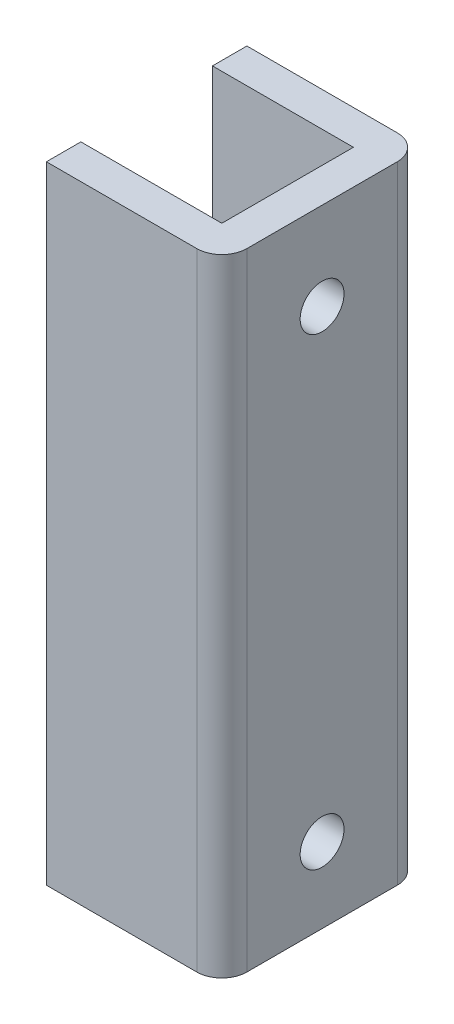
ISO-10303-21;
HEADER;
FILE_DESCRIPTION(('STEP AP214'),'2;1');
FILE_NAME('part.step','',(''),(''),'','','');
FILE_SCHEMA(('AUTOMOTIVE_DESIGN { 1 0 10303 214 1 1 1 1 }'));
ENDSEC;
DATA;
#1=APPLICATION_CONTEXT('core data for automotive mechanical design processes');
#2=APPLICATION_PROTOCOL_DEFINITION('international standard','automotive_design',2000,#1);
#3=PRODUCT_CONTEXT('',#1,'mechanical');
#4=PRODUCT('Part','Part','',(#3));
#5=PRODUCT_RELATED_PRODUCT_CATEGORY('part','',(#4));
#6=PRODUCT_DEFINITION_FORMATION('','',#4);
#7=PRODUCT_DEFINITION_CONTEXT('part definition',#1,'design');
#8=PRODUCT_DEFINITION('design','',#6,#7);
#9=PRODUCT_DEFINITION_SHAPE('','',#8);
#10=(LENGTH_UNIT() NAMED_UNIT(*) SI_UNIT(.MILLI.,.METRE.));
#11=(NAMED_UNIT(*) PLANE_ANGLE_UNIT() SI_UNIT($,.RADIAN.));
#12=(NAMED_UNIT(*) SI_UNIT($,.STERADIAN.) SOLID_ANGLE_UNIT());
#13=UNCERTAINTY_MEASURE_WITH_UNIT(LENGTH_MEASURE(1.E-05),#10,'distance_accuracy_value','');
#14=(GEOMETRIC_REPRESENTATION_CONTEXT(3) GLOBAL_UNCERTAINTY_ASSIGNED_CONTEXT((#13)) GLOBAL_UNIT_ASSIGNED_CONTEXT((#10,
#11,#12)) REPRESENTATION_CONTEXT('',''));
#15=CARTESIAN_POINT('',(0.,0.,0.));
#16=DIRECTION('',(0.,0.,1.));
#17=DIRECTION('',(1.,0.,0.));
#18=AXIS2_PLACEMENT_3D('',#15,#16,#17);
#19=CARTESIAN_POINT('',(-8.95384615384615,50.,-10.5076923076923));
#20=DIRECTION('',(1.,0.,0.));
#21=DIRECTION('',(0.,0.,-1.));
#22=AXIS2_PLACEMENT_3D('',#19,#20,#21);
#23=PLANE('',#22);
#24=DIRECTION('',(0.,0.,1.));
#25=VECTOR('',#24,1.);
#26=CARTESIAN_POINT('',(-8.95384615384615,50.,-10.5076923076923));
#27=LINE('',#26,#25);
#28=CARTESIAN_POINT('',(-8.95384615384615,50.,2.74230769230769));
#29=VERTEX_POINT('',#28);
#30=CARTESIAN_POINT('',(-8.95384615384615,50.,5.49230769230769));
#31=VERTEX_POINT('',#30);
#32=EDGE_CURVE('E228',#29,#31,#27,.T.);
#33=ORIENTED_EDGE('',*,*,#32,.F.);
#34=DIRECTION('',(0.,1.,0.));
#35=VECTOR('',#34,1.);
#36=CARTESIAN_POINT('',(-8.95384615384615,0.,2.74230769230769));
#37=LINE('',#36,#35);
#38=CARTESIAN_POINT('',(-8.95384615384615,0.,2.74230769230769));
#39=VERTEX_POINT('',#38);
#40=EDGE_CURVE('E193',#39,#29,#37,.T.);
#41=ORIENTED_EDGE('',*,*,#40,.F.);
#42=DIRECTION('',(0.,0.,1.));
#43=VECTOR('',#42,1.);
#44=CARTESIAN_POINT('',(-8.95384615384615,0.,-10.5076923076923));
#45=LINE('',#44,#43);
#46=CARTESIAN_POINT('',(-8.95384615384615,0.,5.49230769230769));
#47=VERTEX_POINT('',#46);
#48=EDGE_CURVE('E149',#39,#47,#45,.T.);
#49=ORIENTED_EDGE('',*,*,#48,.T.);
#50=DIRECTION('',(0.,-1.,0.));
#51=VECTOR('',#50,1.);
#52=CARTESIAN_POINT('',(-8.95384615384615,50.,5.49230769230769));
#53=LINE('',#52,#51);
#54=EDGE_CURVE('E49',#31,#47,#53,.T.);
#55=ORIENTED_EDGE('',*,*,#54,.F.);
#56=EDGE_LOOP('',(#33,#41,#49,#55));
#57=FACE_BOUND('',#56,.T.);
#58=ADVANCED_FACE('F39',(#57),#23,.F.);
#59=CARTESIAN_POINT('',(-8.95384615384615,50.,-10.5076923076923));
#60=DIRECTION('',(0.,0.,1.));
#61=DIRECTION('',(1.,0.,0.));
#62=AXIS2_PLACEMENT_3D('',#59,#60,#61);
#63=PLANE('',#62);
#64=DIRECTION('',(-1.,0.,0.));
#65=VECTOR('',#64,1.);
#66=CARTESIAN_POINT('',(-8.95384615384615,0.,-10.5076923076923));
#67=LINE('',#66,#65);
#68=CARTESIAN_POINT('',(3.04615384615385,0.,-10.5076923076923));
#69=VERTEX_POINT('',#68);
#70=CARTESIAN_POINT('',(-8.95384615384615,0.,-10.5076923076923));
#71=VERTEX_POINT('',#70);
#72=EDGE_CURVE('E145',#69,#71,#67,.T.);
#73=ORIENTED_EDGE('',*,*,#72,.T.);
#74=DIRECTION('',(0.,-1.,0.));
#75=VECTOR('',#74,1.);
#76=CARTESIAN_POINT('',(-8.95384615384615,50.,-10.5076923076923));
#77=LINE('',#76,#75);
#78=CARTESIAN_POINT('',(-8.95384615384615,50.,-10.5076923076923));
#79=VERTEX_POINT('',#78);
#80=EDGE_CURVE('E11',#79,#71,#77,.T.);
#81=ORIENTED_EDGE('',*,*,#80,.F.);
#82=DIRECTION('',(-1.,0.,0.));
#83=VECTOR('',#82,1.);
#84=CARTESIAN_POINT('',(-8.95384615384615,50.,-10.5076923076923));
#85=LINE('',#84,#83);
#86=CARTESIAN_POINT('',(3.04615384615385,50.,-10.5076923076923));
#87=VERTEX_POINT('',#86);
#88=EDGE_CURVE('E165',#87,#79,#85,.T.);
#89=ORIENTED_EDGE('',*,*,#88,.F.);
#90=DIRECTION('',(0.,-1.,0.));
#91=VECTOR('',#90,1.);
#92=CARTESIAN_POINT('',(3.04615384615385,50.,-10.5076923076923));
#93=LINE('',#92,#91);
#94=EDGE_CURVE('E141',#87,#69,#93,.T.);
#95=ORIENTED_EDGE('',*,*,#94,.T.);
#96=EDGE_LOOP('',(#73,#81,#89,#95));
#97=FACE_BOUND('',#96,.T.);
#98=ADVANCED_FACE('F41',(#97),#63,.F.);
#99=CARTESIAN_POINT('',(-8.95384615384615,0.,-7.75769230769231));
#100=VERTEX_POINT('',#99);
#101=EDGE_CURVE('E151',#71,#100,#45,.T.);
#102=ORIENTED_EDGE('',*,*,#101,.T.);
#103=DIRECTION('',(0.,1.,0.));
#104=VECTOR('',#103,1.);
#105=CARTESIAN_POINT('',(-8.95384615384615,0.,-7.75769230769231));
#106=LINE('',#105,#104);
#107=CARTESIAN_POINT('',(-8.95384615384615,50.,-7.75769230769231));
#108=VERTEX_POINT('',#107);
#109=EDGE_CURVE('E183',#100,#108,#106,.T.);
#110=ORIENTED_EDGE('',*,*,#109,.T.);
#111=EDGE_CURVE('E101',#79,#108,#27,.T.);
#112=ORIENTED_EDGE('',*,*,#111,.F.);
#113=ORIENTED_EDGE('',*,*,#80,.T.);
#114=EDGE_LOOP('',(#102,#110,#112,#113));
#115=FACE_BOUND('',#114,.T.);
#116=ADVANCED_FACE('F269',(#115),#23,.F.);
#117=CARTESIAN_POINT('',(-8.95384615384615,50.,5.49230769230769));
#118=DIRECTION('',(0.,0.,-1.));
#119=DIRECTION('',(-1.,0.,0.));
#120=AXIS2_PLACEMENT_3D('',#117,#118,#119);
#121=PLANE('',#120);
#122=DIRECTION('',(1.,0.,0.));
#123=VECTOR('',#122,1.);
#124=CARTESIAN_POINT('',(-8.95384615384615,0.,5.49230769230769));
#125=LINE('',#124,#123);
#126=CARTESIAN_POINT('',(3.04615384615385,0.,5.49230769230769));
#127=VERTEX_POINT('',#126);
#128=EDGE_CURVE('E155',#47,#127,#125,.T.);
#129=ORIENTED_EDGE('',*,*,#128,.T.);
#130=DIRECTION('',(0.,-1.,0.));
#131=VECTOR('',#130,1.);
#132=CARTESIAN_POINT('',(3.04615384615385,50.,5.49230769230769));
#133=LINE('',#132,#131);
#134=CARTESIAN_POINT('',(3.04615384615385,50.,5.49230769230769));
#135=VERTEX_POINT('',#134);
#136=EDGE_CURVE('E134',#135,#127,#133,.T.);
#137=ORIENTED_EDGE('',*,*,#136,.F.);
#138=DIRECTION('',(1.,0.,0.));
#139=VECTOR('',#138,1.);
#140=CARTESIAN_POINT('',(-8.95384615384615,50.,5.49230769230769));
#141=LINE('',#140,#139);
#142=EDGE_CURVE('E120',#31,#135,#141,.T.);
#143=ORIENTED_EDGE('',*,*,#142,.F.);
#144=ORIENTED_EDGE('',*,*,#54,.T.);
#145=EDGE_LOOP('',(#129,#137,#143,#144));
#146=FACE_BOUND('',#145,.T.);
#147=ADVANCED_FACE('F242',(#146),#121,.F.);
#148=CARTESIAN_POINT('',(3.04615384615385,50.,3.49230769230769));
#149=DIRECTION('',(0.,-1.,0.));
#150=DIRECTION('',(0.,0.,-1.));
#151=AXIS2_PLACEMENT_3D('',#148,#149,#150);
#152=CYLINDRICAL_SURFACE('',#151,2.);
#153=CARTESIAN_POINT('',(3.04615384615385,0.,3.49230769230769));
#154=DIRECTION('',(0.,1.,0.));
#155=DIRECTION('',(0.,0.,1.));
#156=AXIS2_PLACEMENT_3D('',#153,#154,#155);
#157=CIRCLE('',#156,2.);
#158=CARTESIAN_POINT('',(5.04615384615385,0.,3.49230769230769));
#159=VERTEX_POINT('',#158);
#160=EDGE_CURVE('E130',#127,#159,#157,.T.);
#161=ORIENTED_EDGE('',*,*,#160,.T.);
#162=DIRECTION('',(0.,-1.,0.));
#163=VECTOR('',#162,1.);
#164=CARTESIAN_POINT('',(5.04615384615385,50.,3.49230769230769));
#165=LINE('',#164,#163);
#166=CARTESIAN_POINT('',(5.04615384615385,50.,3.49230769230769));
#167=VERTEX_POINT('',#166);
#168=EDGE_CURVE('E127',#167,#159,#165,.T.);
#169=ORIENTED_EDGE('',*,*,#168,.F.);
#170=CARTESIAN_POINT('',(3.04615384615385,50.,3.49230769230769));
#171=DIRECTION('',(0.,1.,0.));
#172=DIRECTION('',(0.,0.,1.));
#173=AXIS2_PLACEMENT_3D('',#170,#171,#172);
#174=CIRCLE('',#173,2.);
#175=EDGE_CURVE('E112',#135,#167,#174,.T.);
#176=ORIENTED_EDGE('',*,*,#175,.F.);
#177=ORIENTED_EDGE('',*,*,#136,.T.);
#178=EDGE_LOOP('',(#161,#169,#176,#177));
#179=FACE_BOUND('',#178,.T.);
#180=ADVANCED_FACE('F128',(#179),#152,.T.);
#181=CARTESIAN_POINT('',(5.04615384615385,50.,-8.50769230769231));
#182=DIRECTION('',(-1.,0.,0.));
#183=DIRECTION('',(0.,0.,1.));
#184=AXIS2_PLACEMENT_3D('',#181,#182,#183);
#185=PLANE('',#184);
#186=CARTESIAN_POINT('',(5.04615384615385,43.,-2.50769230769231));
#187=DIRECTION('',(1.,0.,0.));
#188=DIRECTION('',(0.,0.,-1.));
#189=AXIS2_PLACEMENT_3D('',#186,#187,#188);
#190=CIRCLE('',#189,1.75);
#191=CARTESIAN_POINT('',(5.04615384615385,43.,-4.25769230769231));
#192=VERTEX_POINT('',#191);
#193=EDGE_CURVE('E177',#192,#192,#190,.T.);
#194=ORIENTED_EDGE('',*,*,#193,.F.);
#195=EDGE_LOOP('',(#194));
#196=FACE_BOUND('',#195,.T.);
#197=CARTESIAN_POINT('',(5.04615384615385,6.00000000000001,-2.50769230769231));
#198=DIRECTION('',(1.,0.,0.));
#199=DIRECTION('',(0.,0.,-1.));
#200=AXIS2_PLACEMENT_3D('',#197,#198,#199);
#201=CIRCLE('',#200,1.75);
#202=CARTESIAN_POINT('',(5.04615384615385,6.00000000000001,-4.25769230769231));
#203=VERTEX_POINT('',#202);
#204=EDGE_CURVE('E185',#203,#203,#201,.T.);
#205=ORIENTED_EDGE('',*,*,#204,.F.);
#206=EDGE_LOOP('',(#205));
#207=FACE_BOUND('',#206,.T.);
#208=DIRECTION('',(0.,0.,-1.));
#209=VECTOR('',#208,1.);
#210=CARTESIAN_POINT('',(5.04615384615385,0.,-8.50769230769231));
#211=LINE('',#210,#209);
#212=CARTESIAN_POINT('',(5.04615384615385,0.,-8.50769230769231));
#213=VERTEX_POINT('',#212);
#214=EDGE_CURVE('E160',#159,#213,#211,.T.);
#215=ORIENTED_EDGE('',*,*,#214,.T.);
#216=DIRECTION('',(0.,-1.,0.));
#217=VECTOR('',#216,1.);
#218=CARTESIAN_POINT('',(5.04615384615385,50.,-8.50769230769231));
#219=LINE('',#218,#217);
#220=CARTESIAN_POINT('',(5.04615384615385,50.,-8.50769230769231));
#221=VERTEX_POINT('',#220);
#222=EDGE_CURVE('E135',#221,#213,#219,.T.);
#223=ORIENTED_EDGE('',*,*,#222,.F.);
#224=DIRECTION('',(0.,0.,-1.));
#225=VECTOR('',#224,1.);
#226=CARTESIAN_POINT('',(5.04615384615385,50.,-8.50769230769231));
#227=LINE('',#226,#225);
#228=EDGE_CURVE('E117',#167,#221,#227,.T.);
#229=ORIENTED_EDGE('',*,*,#228,.F.);
#230=ORIENTED_EDGE('',*,*,#168,.T.);
#231=EDGE_LOOP('',(#215,#223,#229,#230));
#232=FACE_BOUND('',#231,.T.);
#233=ADVANCED_FACE('F137',(#196,#207,#232),#185,.F.);
#234=CARTESIAN_POINT('',(3.04615384615385,50.,-8.50769230769231));
#235=DIRECTION('',(0.,-1.,0.));
#236=DIRECTION('',(0.,0.,-1.));
#237=AXIS2_PLACEMENT_3D('',#234,#235,#236);
#238=CYLINDRICAL_SURFACE('',#237,2.);
#239=CARTESIAN_POINT('',(3.04615384615385,0.,-8.50769230769231));
#240=DIRECTION('',(0.,1.,0.));
#241=DIRECTION('',(0.,0.,-1.));
#242=AXIS2_PLACEMENT_3D('',#239,#240,#241);
#243=CIRCLE('',#242,2.);
#244=EDGE_CURVE('E93',#213,#69,#243,.T.);
#245=ORIENTED_EDGE('',*,*,#244,.T.);
#246=ORIENTED_EDGE('',*,*,#94,.F.);
#247=CARTESIAN_POINT('',(3.04615384615385,50.,-8.50769230769231));
#248=DIRECTION('',(0.,1.,0.));
#249=DIRECTION('',(0.,0.,-1.));
#250=AXIS2_PLACEMENT_3D('',#247,#248,#249);
#251=CIRCLE('',#250,2.);
#252=EDGE_CURVE('E66',#221,#87,#251,.T.);
#253=ORIENTED_EDGE('',*,*,#252,.F.);
#254=ORIENTED_EDGE('',*,*,#222,.T.);
#255=EDGE_LOOP('',(#245,#246,#253,#254));
#256=FACE_BOUND('',#255,.T.);
#257=ADVANCED_FACE('F245',(#256),#238,.T.);
#258=CARTESIAN_POINT('',(3.04615384615385,50.,-8.50769230769231));
#259=DIRECTION('',(0.,-1.,0.));
#260=DIRECTION('',(0.,0.,-1.));
#261=AXIS2_PLACEMENT_3D('',#258,#259,#260);
#262=PLANE('',#261);
#263=DIRECTION('',(1.,0.,0.));
#264=VECTOR('',#263,1.);
#265=CARTESIAN_POINT('',(-6.20384615384615,50.,2.74230769230769));
#266=LINE('',#265,#264);
#267=CARTESIAN_POINT('',(2.29615384615385,50.,2.74230769230769));
#268=VERTEX_POINT('',#267);
#269=EDGE_CURVE('E204',#29,#268,#266,.T.);
#270=ORIENTED_EDGE('',*,*,#269,.F.);
#271=ORIENTED_EDGE('',*,*,#32,.T.);
#272=ORIENTED_EDGE('',*,*,#142,.T.);
#273=ORIENTED_EDGE('',*,*,#175,.T.);
#274=ORIENTED_EDGE('',*,*,#228,.T.);
#275=ORIENTED_EDGE('',*,*,#252,.T.);
#276=ORIENTED_EDGE('',*,*,#88,.T.);
#277=ORIENTED_EDGE('',*,*,#111,.T.);
#278=DIRECTION('',(-1.,0.,0.));
#279=VECTOR('',#278,1.);
#280=CARTESIAN_POINT('',(2.29615384615385,50.,-7.75769230769231));
#281=LINE('',#280,#279);
#282=CARTESIAN_POINT('',(2.29615384615385,50.,-7.75769230769231));
#283=VERTEX_POINT('',#282);
#284=EDGE_CURVE('E215',#283,#108,#281,.T.);
#285=ORIENTED_EDGE('',*,*,#284,.F.);
#286=DIRECTION('',(0.,0.,-1.));
#287=VECTOR('',#286,1.);
#288=CARTESIAN_POINT('',(2.29615384615385,50.,2.74230769230769));
#289=LINE('',#288,#287);
#290=EDGE_CURVE('E57',#268,#283,#289,.T.);
#291=ORIENTED_EDGE('',*,*,#290,.F.);
#292=EDGE_LOOP('',(#270,#271,#272,#273,#274,#275,#276,#277,#285,#291));
#293=FACE_BOUND('',#292,.T.);
#294=ADVANCED_FACE('F115',(#293),#262,.F.);
#295=CARTESIAN_POINT('',(3.04615384615385,0.,-8.50769230769231));
#296=DIRECTION('',(0.,-1.,0.));
#297=DIRECTION('',(0.,0.,-1.));
#298=AXIS2_PLACEMENT_3D('',#295,#296,#297);
#299=PLANE('',#298);
#300=ORIENTED_EDGE('',*,*,#48,.F.);
#301=DIRECTION('',(1.,0.,0.));
#302=VECTOR('',#301,1.);
#303=CARTESIAN_POINT('',(-6.20384615384615,0.,2.74230769230769));
#304=LINE('',#303,#302);
#305=CARTESIAN_POINT('',(2.29615384615385,0.,2.74230769230769));
#306=VERTEX_POINT('',#305);
#307=EDGE_CURVE('E208',#39,#306,#304,.T.);
#308=ORIENTED_EDGE('',*,*,#307,.T.);
#309=DIRECTION('',(0.,0.,-1.));
#310=VECTOR('',#309,1.);
#311=CARTESIAN_POINT('',(2.29615384615385,0.,2.74230769230769));
#312=LINE('',#311,#310);
#313=CARTESIAN_POINT('',(2.29615384615385,0.,-7.75769230769231));
#314=VERTEX_POINT('',#313);
#315=EDGE_CURVE('E199',#306,#314,#312,.T.);
#316=ORIENTED_EDGE('',*,*,#315,.T.);
#317=DIRECTION('',(-1.,0.,0.));
#318=VECTOR('',#317,1.);
#319=CARTESIAN_POINT('',(2.29615384615385,0.,-7.75769230769231));
#320=LINE('',#319,#318);
#321=EDGE_CURVE('E203',#314,#100,#320,.T.);
#322=ORIENTED_EDGE('',*,*,#321,.T.);
#323=ORIENTED_EDGE('',*,*,#101,.F.);
#324=ORIENTED_EDGE('',*,*,#72,.F.);
#325=ORIENTED_EDGE('',*,*,#244,.F.);
#326=ORIENTED_EDGE('',*,*,#214,.F.);
#327=ORIENTED_EDGE('',*,*,#160,.F.);
#328=ORIENTED_EDGE('',*,*,#128,.F.);
#329=EDGE_LOOP('',(#300,#308,#316,#322,#323,#324,#325,#326,#327,#328));
#330=FACE_BOUND('',#329,.T.);
#331=ADVANCED_FACE('F243',(#330),#299,.T.);
#332=CARTESIAN_POINT('',(2.29615384615385,0.,2.74230769230769));
#333=DIRECTION('',(1.,0.,0.));
#334=DIRECTION('',(0.,0.,-1.));
#335=AXIS2_PLACEMENT_3D('',#332,#333,#334);
#336=PLANE('',#335);
#337=CARTESIAN_POINT('',(2.29615384615385,43.,-2.50769230769231));
#338=DIRECTION('',(1.,0.,0.));
#339=DIRECTION('',(0.,0.,-1.));
#340=AXIS2_PLACEMENT_3D('',#337,#338,#339);
#341=CIRCLE('',#340,1.75);
#342=CARTESIAN_POINT('',(2.29615384615385,43.,-4.25769230769231));
#343=VERTEX_POINT('',#342);
#344=EDGE_CURVE('E43',#343,#343,#341,.T.);
#345=ORIENTED_EDGE('',*,*,#344,.T.);
#346=EDGE_LOOP('',(#345));
#347=FACE_BOUND('',#346,.T.);
#348=CARTESIAN_POINT('',(2.29615384615385,6.00000000000001,-2.50769230769231));
#349=DIRECTION('',(1.,0.,0.));
#350=DIRECTION('',(0.,0.,-1.));
#351=AXIS2_PLACEMENT_3D('',#348,#349,#350);
#352=CIRCLE('',#351,1.75);
#353=CARTESIAN_POINT('',(2.29615384615385,6.00000000000001,-4.25769230769231));
#354=VERTEX_POINT('',#353);
#355=EDGE_CURVE('E174',#354,#354,#352,.T.);
#356=ORIENTED_EDGE('',*,*,#355,.T.);
#357=EDGE_LOOP('',(#356));
#358=FACE_BOUND('',#357,.T.);
#359=ORIENTED_EDGE('',*,*,#290,.T.);
#360=DIRECTION('',(0.,1.,0.));
#361=VECTOR('',#360,1.);
#362=CARTESIAN_POINT('',(2.29615384615385,0.,-7.75769230769231));
#363=LINE('',#362,#361);
#364=EDGE_CURVE('E212',#314,#283,#363,.T.);
#365=ORIENTED_EDGE('',*,*,#364,.F.);
#366=ORIENTED_EDGE('',*,*,#315,.F.);
#367=DIRECTION('',(0.,1.,0.));
#368=VECTOR('',#367,1.);
#369=CARTESIAN_POINT('',(2.29615384615385,0.,2.74230769230769));
#370=LINE('',#369,#368);
#371=EDGE_CURVE('E150',#306,#268,#370,.T.);
#372=ORIENTED_EDGE('',*,*,#371,.T.);
#373=EDGE_LOOP('',(#359,#365,#366,#372));
#374=FACE_BOUND('',#373,.T.);
#375=ADVANCED_FACE('F266',(#347,#358,#374),#336,.F.);
#376=CARTESIAN_POINT('',(-6.20384615384615,0.,2.74230769230769));
#377=DIRECTION('',(0.,0.,1.));
#378=DIRECTION('',(1.,0.,0.));
#379=AXIS2_PLACEMENT_3D('',#376,#377,#378);
#380=PLANE('',#379);
#381=ORIENTED_EDGE('',*,*,#269,.T.);
#382=ORIENTED_EDGE('',*,*,#371,.F.);
#383=ORIENTED_EDGE('',*,*,#307,.F.);
#384=ORIENTED_EDGE('',*,*,#40,.T.);
#385=EDGE_LOOP('',(#381,#382,#383,#384));
#386=FACE_BOUND('',#385,.T.);
#387=ADVANCED_FACE('F265',(#386),#380,.F.);
#388=CARTESIAN_POINT('',(2.29615384615385,0.,-7.75769230769231));
#389=DIRECTION('',(0.,0.,-1.));
#390=DIRECTION('',(-1.,0.,0.));
#391=AXIS2_PLACEMENT_3D('',#388,#389,#390);
#392=PLANE('',#391);
#393=ORIENTED_EDGE('',*,*,#284,.T.);
#394=ORIENTED_EDGE('',*,*,#109,.F.);
#395=ORIENTED_EDGE('',*,*,#321,.F.);
#396=ORIENTED_EDGE('',*,*,#364,.T.);
#397=EDGE_LOOP('',(#393,#394,#395,#396));
#398=FACE_BOUND('',#397,.T.);
#399=ADVANCED_FACE('F268',(#398),#392,.F.);
#400=CARTESIAN_POINT('',(-8.95384615384616,6.00000000000001,-2.5076923076923));
#401=DIRECTION('',(1.,0.,0.));
#402=DIRECTION('',(0.,0.,-1.));
#403=AXIS2_PLACEMENT_3D('',#400,#401,#402);
#404=CYLINDRICAL_SURFACE('',#403,1.75);
#405=ORIENTED_EDGE('',*,*,#204,.T.);
#406=EDGE_LOOP('',(#405));
#407=FACE_BOUND('',#406,.T.);
#408=ORIENTED_EDGE('',*,*,#355,.F.);
#409=EDGE_LOOP('',(#408));
#410=FACE_BOUND('',#409,.T.);
#411=ADVANCED_FACE('F344',(#407,#410),#404,.F.);
#412=CARTESIAN_POINT('',(-8.95384615384616,43.,-2.5076923076923));
#413=DIRECTION('',(1.,0.,0.));
#414=DIRECTION('',(0.,0.,-1.));
#415=AXIS2_PLACEMENT_3D('',#412,#413,#414);
#416=CYLINDRICAL_SURFACE('',#415,1.75);
#417=ORIENTED_EDGE('',*,*,#193,.T.);
#418=EDGE_LOOP('',(#417));
#419=FACE_BOUND('',#418,.T.);
#420=ORIENTED_EDGE('',*,*,#344,.F.);
#421=EDGE_LOOP('',(#420));
#422=FACE_BOUND('',#421,.T.);
#423=ADVANCED_FACE('F350',(#419,#422),#416,.F.);
#424=CLOSED_SHELL('',(#58,#98,#116,#147,#180,#233,#257,#294,#331,#375,#387,#399,#411,#423));
#425=MANIFOLD_SOLID_BREP('B2',#424);
#426=ADVANCED_BREP_SHAPE_REPRESENTATION('',(#18,#425),#14);
#427=SHAPE_DEFINITION_REPRESENTATION(#9,#426);
ENDSEC;
END-ISO-10303-21;
